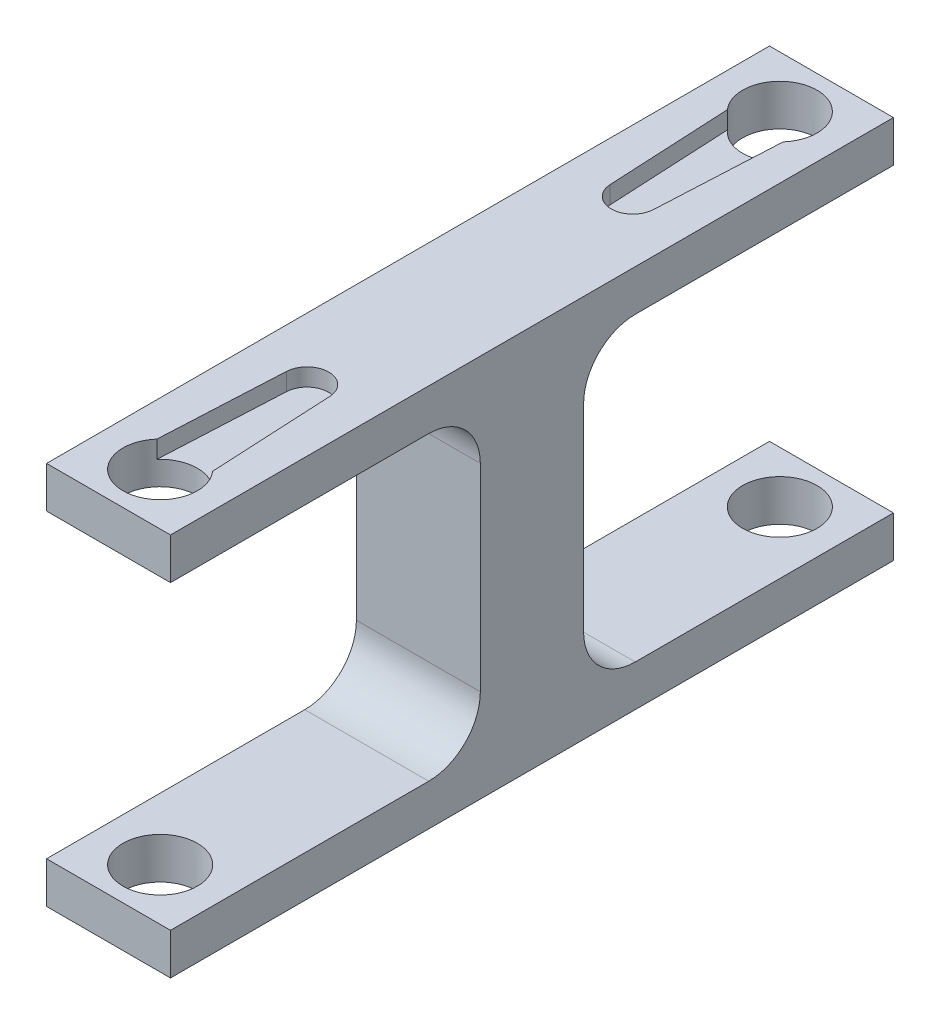
ISO-10303-21;
HEADER;
FILE_DESCRIPTION(('STEP AP214'),'2;1');
FILE_NAME('part.step','',(''),(''),'','','');
FILE_SCHEMA(('AUTOMOTIVE_DESIGN { 1 0 10303 214 1 1 1 1 }'));
ENDSEC;
DATA;
#1=APPLICATION_CONTEXT('core data for automotive mechanical design processes');
#2=APPLICATION_PROTOCOL_DEFINITION('international standard','automotive_design',2000,#1);
#3=PRODUCT_CONTEXT('',#1,'mechanical');
#4=PRODUCT('Part','Part','',(#3));
#5=PRODUCT_RELATED_PRODUCT_CATEGORY('part','',(#4));
#6=PRODUCT_DEFINITION_FORMATION('','',#4);
#7=PRODUCT_DEFINITION_CONTEXT('part definition',#1,'design');
#8=PRODUCT_DEFINITION('design','',#6,#7);
#9=PRODUCT_DEFINITION_SHAPE('','',#8);
#10=(LENGTH_UNIT() NAMED_UNIT(*) SI_UNIT(.MILLI.,.METRE.));
#11=(NAMED_UNIT(*) PLANE_ANGLE_UNIT() SI_UNIT($,.RADIAN.));
#12=(NAMED_UNIT(*) SI_UNIT($,.STERADIAN.) SOLID_ANGLE_UNIT());
#13=UNCERTAINTY_MEASURE_WITH_UNIT(LENGTH_MEASURE(1.E-05),#10,'distance_accuracy_value','');
#14=(GEOMETRIC_REPRESENTATION_CONTEXT(3) GLOBAL_UNCERTAINTY_ASSIGNED_CONTEXT((#13)) GLOBAL_UNIT_ASSIGNED_CONTEXT((#10,
#11,#12)) REPRESENTATION_CONTEXT('',''));
#15=CARTESIAN_POINT('',(0.,0.,0.));
#16=DIRECTION('',(0.,0.,1.));
#17=DIRECTION('',(1.,0.,0.));
#18=AXIS2_PLACEMENT_3D('',#15,#16,#17);
#19=CARTESIAN_POINT('',(0.,0.,-7.5));
#20=DIRECTION('',(0.,0.,-1.));
#21=DIRECTION('',(-1.,0.,0.));
#22=AXIS2_PLACEMENT_3D('',#19,#20,#21);
#23=PLANE('',#22);
#24=DIRECTION('',(0.,-1.,0.));
#25=VECTOR('',#24,1.);
#26=CARTESIAN_POINT('',(3.38839891031811,0.966548743541004,-7.5));
#27=LINE('',#26,#25);
#28=CARTESIAN_POINT('',(3.38839891031811,-8.033451256459,-7.5));
#29=VERTEX_POINT('',#28);
#30=CARTESIAN_POINT('',(3.38839891031811,-27.183451256459,-7.5));
#31=VERTEX_POINT('',#30);
#32=EDGE_CURVE('E277',#29,#31,#27,.T.);
#33=ORIENTED_EDGE('',*,*,#32,.T.);
#34=DIRECTION('',(1.,0.,0.));
#35=VECTOR('',#34,1.);
#36=CARTESIAN_POINT('',(0.,-27.183451256459,-7.5));
#37=LINE('',#36,#35);
#38=CARTESIAN_POINT('',(-8.61160108968189,-27.183451256459,-7.5));
#39=VERTEX_POINT('',#38);
#40=EDGE_CURVE('E60',#31,#39,#37,.F.);
#41=ORIENTED_EDGE('',*,*,#40,.T.);
#42=DIRECTION('',(0.,1.,0.));
#43=VECTOR('',#42,1.);
#44=CARTESIAN_POINT('',(-8.61160108968189,0.966548743541004,-7.5));
#45=LINE('',#44,#43);
#46=CARTESIAN_POINT('',(-8.61160108968189,-8.03345125645899,-7.5));
#47=VERTEX_POINT('',#46);
#48=EDGE_CURVE('E279',#39,#47,#45,.T.);
#49=ORIENTED_EDGE('',*,*,#48,.T.);
#50=DIRECTION('',(-1.,0.,0.));
#51=VECTOR('',#50,1.);
#52=CARTESIAN_POINT('',(0.,-8.033451256459,-7.5));
#53=LINE('',#52,#51);
#54=EDGE_CURVE('E378',#47,#29,#53,.F.);
#55=ORIENTED_EDGE('',*,*,#54,.T.);
#56=EDGE_LOOP('',(#33,#41,#49,#55));
#57=FACE_BOUND('',#56,.T.);
#58=ADVANCED_FACE('F39',(#57),#23,.T.);
#59=CARTESIAN_POINT('',(0.,0.,2.5));
#60=DIRECTION('',(0.,0.,1.));
#61=DIRECTION('',(1.,0.,0.));
#62=AXIS2_PLACEMENT_3D('',#59,#60,#61);
#63=PLANE('',#62);
#64=DIRECTION('',(0.,-1.,0.));
#65=VECTOR('',#64,1.);
#66=CARTESIAN_POINT('',(-8.61160108968189,0.,2.5));
#67=LINE('',#66,#65);
#68=CARTESIAN_POINT('',(-8.61160108968189,-8.033451256459,2.5));
#69=VERTEX_POINT('',#68);
#70=CARTESIAN_POINT('',(-8.61160108968189,-27.183451256459,2.5));
#71=VERTEX_POINT('',#70);
#72=EDGE_CURVE('E346',#69,#71,#67,.T.);
#73=ORIENTED_EDGE('',*,*,#72,.T.);
#74=DIRECTION('',(-1.,0.,0.));
#75=VECTOR('',#74,1.);
#76=CARTESIAN_POINT('',(0.,-27.183451256459,2.5));
#77=LINE('',#76,#75);
#78=CARTESIAN_POINT('',(3.38839891031811,-27.183451256459,2.5));
#79=VERTEX_POINT('',#78);
#80=EDGE_CURVE('E369',#71,#79,#77,.F.);
#81=ORIENTED_EDGE('',*,*,#80,.T.);
#82=DIRECTION('',(0.,-1.,0.));
#83=VECTOR('',#82,1.);
#84=CARTESIAN_POINT('',(3.38839891031811,0.,2.5));
#85=LINE('',#84,#83);
#86=CARTESIAN_POINT('',(3.38839891031811,-8.033451256459,2.5));
#87=VERTEX_POINT('',#86);
#88=EDGE_CURVE('E343',#87,#79,#85,.T.);
#89=ORIENTED_EDGE('',*,*,#88,.F.);
#90=DIRECTION('',(1.,0.,0.));
#91=VECTOR('',#90,1.);
#92=CARTESIAN_POINT('',(0.,-8.033451256459,2.5));
#93=LINE('',#92,#91);
#94=EDGE_CURVE('E360',#87,#69,#93,.F.);
#95=ORIENTED_EDGE('',*,*,#94,.T.);
#96=EDGE_LOOP('',(#73,#81,#89,#95));
#97=FACE_BOUND('',#96,.T.);
#98=ADVANCED_FACE('F413',(#97),#63,.T.);
#99=CARTESIAN_POINT('',(3.38839891031811,0.,2.5));
#100=DIRECTION('',(1.,0.,0.));
#101=DIRECTION('',(0.,1.,0.));
#102=AXIS2_PLACEMENT_3D('',#99,#100,#101);
#103=PLANE('',#102);
#104=DIRECTION('',(0.,0.,-1.));
#105=VECTOR('',#104,1.);
#106=CARTESIAN_POINT('',(3.38839891031812,-36.183451256459,2.5));
#107=LINE('',#106,#105);
#108=CARTESIAN_POINT('',(3.38839891031811,-36.183451256459,32.5));
#109=VERTEX_POINT('',#108);
#110=CARTESIAN_POINT('',(3.38839891031811,-36.183451256459,-37.5));
#111=VERTEX_POINT('',#110);
#112=EDGE_CURVE('E349',#109,#111,#107,.T.);
#113=ORIENTED_EDGE('',*,*,#112,.T.);
#114=DIRECTION('',(0.,-1.,0.));
#115=VECTOR('',#114,1.);
#116=CARTESIAN_POINT('',(3.38839891031811,-36.183451256459,-37.5));
#117=LINE('',#116,#115);
#118=CARTESIAN_POINT('',(3.38839891031811,-32.183451256459,-37.5));
#119=VERTEX_POINT('',#118);
#120=EDGE_CURVE('E220',#119,#111,#117,.T.);
#121=ORIENTED_EDGE('',*,*,#120,.F.);
#122=DIRECTION('',(0.,0.,1.));
#123=VECTOR('',#122,1.);
#124=CARTESIAN_POINT('',(3.38839891031811,-32.183451256459,-37.5));
#125=LINE('',#124,#123);
#126=CARTESIAN_POINT('',(3.38839891031811,-32.183451256459,-12.5));
#127=VERTEX_POINT('',#126);
#128=EDGE_CURVE('E255',#119,#127,#125,.T.);
#129=ORIENTED_EDGE('',*,*,#128,.T.);
#130=CARTESIAN_POINT('',(3.38839891031811,-27.183451256459,-12.5));
#131=DIRECTION('',(1.,0.,0.));
#132=DIRECTION('',(0.,1.,0.));
#133=AXIS2_PLACEMENT_3D('',#130,#131,#132);
#134=CIRCLE('',#133,5.);
#135=EDGE_CURVE('E47',#127,#31,#134,.F.);
#136=ORIENTED_EDGE('',*,*,#135,.T.);
#137=ORIENTED_EDGE('',*,*,#32,.F.);
#138=CARTESIAN_POINT('',(3.38839891031811,-8.033451256459,-12.5));
#139=DIRECTION('',(1.,0.,0.));
#140=DIRECTION('',(0.,1.,0.));
#141=AXIS2_PLACEMENT_3D('',#138,#139,#140);
#142=CIRCLE('',#141,5.);
#143=CARTESIAN_POINT('',(3.38839891031811,-3.033451256459,-12.5));
#144=VERTEX_POINT('',#143);
#145=EDGE_CURVE('E383',#29,#144,#142,.F.);
#146=ORIENTED_EDGE('',*,*,#145,.T.);
#147=DIRECTION('',(0.,0.,1.));
#148=VECTOR('',#147,1.);
#149=CARTESIAN_POINT('',(3.38839891031811,-3.033451256459,-37.5));
#150=LINE('',#149,#148);
#151=CARTESIAN_POINT('',(3.38839891031811,-3.033451256459,-37.5));
#152=VERTEX_POINT('',#151);
#153=EDGE_CURVE('E274',#152,#144,#150,.T.);
#154=ORIENTED_EDGE('',*,*,#153,.F.);
#155=DIRECTION('',(0.,-1.,0.));
#156=VECTOR('',#155,1.);
#157=CARTESIAN_POINT('',(3.38839891031811,0.966548743541004,-37.5));
#158=LINE('',#157,#156);
#159=CARTESIAN_POINT('',(3.38839891031811,0.966548743541004,-37.5));
#160=VERTEX_POINT('',#159);
#161=EDGE_CURVE('E260',#160,#152,#158,.T.);
#162=ORIENTED_EDGE('',*,*,#161,.F.);
#163=DIRECTION('',(0.,0.,-1.));
#164=VECTOR('',#163,1.);
#165=CARTESIAN_POINT('',(3.38839891031811,0.966548743541004,2.5));
#166=LINE('',#165,#164);
#167=CARTESIAN_POINT('',(3.38839891031811,0.966548743541004,32.5));
#168=VERTEX_POINT('',#167);
#169=EDGE_CURVE('E355',#168,#160,#166,.T.);
#170=ORIENTED_EDGE('',*,*,#169,.F.);
#171=DIRECTION('',(0.,1.,0.));
#172=VECTOR('',#171,1.);
#173=CARTESIAN_POINT('',(3.38839891031811,0.966548743541004,32.5));
#174=LINE('',#173,#172);
#175=CARTESIAN_POINT('',(3.38839891031811,-3.033451256459,32.5));
#176=VERTEX_POINT('',#175);
#177=EDGE_CURVE('E331',#176,#168,#174,.T.);
#178=ORIENTED_EDGE('',*,*,#177,.F.);
#179=DIRECTION('',(0.,0.,-1.));
#180=VECTOR('',#179,1.);
#181=CARTESIAN_POINT('',(3.38839891031811,-3.033451256459,32.5));
#182=LINE('',#181,#180);
#183=CARTESIAN_POINT('',(3.38839891031811,-3.033451256459,7.5));
#184=VERTEX_POINT('',#183);
#185=EDGE_CURVE('E337',#176,#184,#182,.T.);
#186=ORIENTED_EDGE('',*,*,#185,.T.);
#187=CARTESIAN_POINT('',(3.38839891031811,-8.033451256459,7.5));
#188=DIRECTION('',(1.,0.,0.));
#189=DIRECTION('',(0.,1.,0.));
#190=AXIS2_PLACEMENT_3D('',#187,#188,#189);
#191=CIRCLE('',#190,5.);
#192=EDGE_CURVE('E362',#184,#87,#191,.F.);
#193=ORIENTED_EDGE('',*,*,#192,.T.);
#194=ORIENTED_EDGE('',*,*,#88,.T.);
#195=CARTESIAN_POINT('',(3.38839891031811,-27.183451256459,7.5));
#196=DIRECTION('',(1.,0.,0.));
#197=DIRECTION('',(0.,1.,0.));
#198=AXIS2_PLACEMENT_3D('',#195,#196,#197);
#199=CIRCLE('',#198,5.);
#200=CARTESIAN_POINT('',(3.38839891031811,-32.183451256459,7.5));
#201=VERTEX_POINT('',#200);
#202=EDGE_CURVE('E373',#79,#201,#199,.F.);
#203=ORIENTED_EDGE('',*,*,#202,.T.);
#204=DIRECTION('',(0.,0.,-1.));
#205=VECTOR('',#204,1.);
#206=CARTESIAN_POINT('',(3.38839891031811,-32.183451256459,32.5));
#207=LINE('',#206,#205);
#208=CARTESIAN_POINT('',(3.38839891031811,-32.183451256459,32.5));
#209=VERTEX_POINT('',#208);
#210=EDGE_CURVE('E323',#209,#201,#207,.T.);
#211=ORIENTED_EDGE('',*,*,#210,.F.);
#212=DIRECTION('',(0.,1.,0.));
#213=VECTOR('',#212,1.);
#214=CARTESIAN_POINT('',(3.38839891031811,-36.183451256459,32.5));
#215=LINE('',#214,#213);
#216=EDGE_CURVE('E316',#109,#209,#215,.T.);
#217=ORIENTED_EDGE('',*,*,#216,.F.);
#218=EDGE_LOOP('',(#113,#121,#129,#136,#137,#146,#154,#162,#170,#178,#186,#193,#194,#203,#211,#217));
#219=FACE_BOUND('',#218,.T.);
#220=ADVANCED_FACE('F397',(#219),#103,.T.);
#221=CARTESIAN_POINT('',(0.,0.966548743541004,2.5));
#222=DIRECTION('',(0.,1.,0.));
#223=DIRECTION('',(0.,0.,1.));
#224=AXIS2_PLACEMENT_3D('',#221,#222,#223);
#225=PLANE('',#224);
#226=CARTESIAN_POINT('',(-2.61160108968189,0.966548743541004,-32.5));
#227=DIRECTION('',(0.,1.,0.));
#228=DIRECTION('',(0.,0.,1.));
#229=AXIS2_PLACEMENT_3D('',#226,#227,#228);
#230=CIRCLE('',#229,3.6);
#231=CARTESIAN_POINT('',(0.088398910318118,0.966548743541004,-30.1188238200419));
#232=VERTEX_POINT('',#231);
#233=CARTESIAN_POINT('',(-5.31160108968188,0.966548743541004,-30.1188238200419));
#234=VERTEX_POINT('',#233);
#235=EDGE_CURVE('E234',#232,#234,#230,.T.);
#236=ORIENTED_EDGE('',*,*,#235,.F.);
#237=DIRECTION('',(0.050368035382124,0.,-0.99873072497633));
#238=VECTOR('',#237,1.);
#239=CARTESIAN_POINT('',(0.088398910318118,0.966548743541004,-30.1188238200419));
#240=LINE('',#239,#238);
#241=CARTESIAN_POINT('',(-0.514266567231549,0.966548743541004,-18.1687740564372));
#242=VERTEX_POINT('',#241);
#243=EDGE_CURVE('E218',#242,#232,#240,.T.);
#244=ORIENTED_EDGE('',*,*,#243,.F.);
#245=CARTESIAN_POINT('',(-2.61160108968184,0.966548743541004,-18.2745469307396));
#246=DIRECTION('',(0.,1.,0.));
#247=DIRECTION('',(0.,0.,1.));
#248=AXIS2_PLACEMENT_3D('',#245,#246,#247);
#249=CIRCLE('',#248,2.1);
#250=CARTESIAN_POINT('',(-4.70893561213213,0.966548743541004,-18.1687740564372));
#251=VERTEX_POINT('',#250);
#252=EDGE_CURVE('E240',#251,#242,#249,.T.);
#253=ORIENTED_EDGE('',*,*,#252,.F.);
#254=DIRECTION('',(0.050368035382131,0.,0.998730724976329));
#255=VECTOR('',#254,1.);
#256=CARTESIAN_POINT('',(-4.70893561213213,0.966548743541004,-18.1687740564372));
#257=LINE('',#256,#255);
#258=EDGE_CURVE('E236',#234,#251,#257,.T.);
#259=ORIENTED_EDGE('',*,*,#258,.F.);
#260=EDGE_LOOP('',(#236,#244,#253,#259));
#261=FACE_BOUND('',#260,.T.);
#262=CARTESIAN_POINT('',(-2.61160108968189,0.966548743541004,27.5));
#263=DIRECTION('',(0.,1.,0.));
#264=DIRECTION('',(0.,0.,1.));
#265=AXIS2_PLACEMENT_3D('',#262,#263,#264);
#266=CIRCLE('',#265,3.6);
#267=CARTESIAN_POINT('',(-5.31160108968192,0.966548743541004,25.1188238200419));
#268=VERTEX_POINT('',#267);
#269=CARTESIAN_POINT('',(0.0883989103180828,0.966548743541004,25.1188238200418));
#270=VERTEX_POINT('',#269);
#271=EDGE_CURVE('E281',#268,#270,#266,.T.);
#272=ORIENTED_EDGE('',*,*,#271,.F.);
#273=DIRECTION('',(-0.0503680353821171,0.,0.99873072497633));
#274=VECTOR('',#273,1.);
#275=CARTESIAN_POINT('',(-5.31160108968192,0.966548743541004,25.1188238200419));
#276=LINE('',#275,#274);
#277=CARTESIAN_POINT('',(-4.70893561213234,0.966548743541004,13.1687740564373));
#278=VERTEX_POINT('',#277);
#279=EDGE_CURVE('E286',#278,#268,#276,.T.);
#280=ORIENTED_EDGE('',*,*,#279,.F.);
#281=CARTESIAN_POINT('',(-2.61160108968204,0.966548743541004,13.2745469307397));
#282=DIRECTION('',(0.,1.,0.));
#283=DIRECTION('',(0.,0.,1.));
#284=AXIS2_PLACEMENT_3D('',#281,#282,#283);
#285=CIRCLE('',#284,2.1);
#286=CARTESIAN_POINT('',(-0.514266567231752,0.966548743541004,13.1687740564372));
#287=VERTEX_POINT('',#286);
#288=EDGE_CURVE('E297',#287,#278,#285,.T.);
#289=ORIENTED_EDGE('',*,*,#288,.F.);
#290=DIRECTION('',(-0.0503680353821383,0.,-0.998730724976329));
#291=VECTOR('',#290,1.);
#292=CARTESIAN_POINT('',(-0.514266567231752,0.966548743541004,13.1687740564372));
#293=LINE('',#292,#291);
#294=EDGE_CURVE('E294',#270,#287,#293,.T.);
#295=ORIENTED_EDGE('',*,*,#294,.F.);
#296=EDGE_LOOP('',(#272,#280,#289,#295));
#297=FACE_BOUND('',#296,.T.);
#298=ORIENTED_EDGE('',*,*,#169,.T.);
#299=DIRECTION('',(1.,0.,0.));
#300=VECTOR('',#299,1.);
#301=CARTESIAN_POINT('',(3.38839891031811,0.966548743541004,-37.5));
#302=LINE('',#301,#300);
#303=CARTESIAN_POINT('',(-8.61160108968189,0.966548743541004,-37.5));
#304=VERTEX_POINT('',#303);
#305=EDGE_CURVE('E268',#304,#160,#302,.T.);
#306=ORIENTED_EDGE('',*,*,#305,.F.);
#307=DIRECTION('',(0.,0.,-1.));
#308=VECTOR('',#307,1.);
#309=CARTESIAN_POINT('',(-8.61160108968189,0.966548743541004,2.5));
#310=LINE('',#309,#308);
#311=CARTESIAN_POINT('',(-8.61160108968189,0.966548743541004,32.5));
#312=VERTEX_POINT('',#311);
#313=EDGE_CURVE('E353',#312,#304,#310,.T.);
#314=ORIENTED_EDGE('',*,*,#313,.F.);
#315=DIRECTION('',(-1.,0.,0.));
#316=VECTOR('',#315,1.);
#317=CARTESIAN_POINT('',(-8.61160108968189,0.966548743541004,32.5));
#318=LINE('',#317,#316);
#319=EDGE_CURVE('E334',#168,#312,#318,.T.);
#320=ORIENTED_EDGE('',*,*,#319,.F.);
#321=EDGE_LOOP('',(#298,#306,#314,#320));
#322=FACE_BOUND('',#321,.T.);
#323=ADVANCED_FACE('F466',(#261,#297,#322),#225,.T.);
#324=CARTESIAN_POINT('',(-8.61160108968189,0.,2.5));
#325=DIRECTION('',(1.,0.,0.));
#326=DIRECTION('',(0.,1.,0.));
#327=AXIS2_PLACEMENT_3D('',#324,#325,#326);
#328=PLANE('',#327);
#329=ORIENTED_EDGE('',*,*,#313,.T.);
#330=DIRECTION('',(0.,1.,0.));
#331=VECTOR('',#330,1.);
#332=CARTESIAN_POINT('',(-8.61160108968189,0.966548743541004,-37.5));
#333=LINE('',#332,#331);
#334=CARTESIAN_POINT('',(-8.61160108968189,-3.03345125645899,-37.5));
#335=VERTEX_POINT('',#334);
#336=EDGE_CURVE('E265',#335,#304,#333,.T.);
#337=ORIENTED_EDGE('',*,*,#336,.F.);
#338=DIRECTION('',(0.,0.,1.));
#339=VECTOR('',#338,1.);
#340=CARTESIAN_POINT('',(-8.61160108968189,-3.03345125645899,-37.5));
#341=LINE('',#340,#339);
#342=CARTESIAN_POINT('',(-8.61160108968189,-3.03345125645899,-12.5));
#343=VERTEX_POINT('',#342);
#344=EDGE_CURVE('E271',#335,#343,#341,.T.);
#345=ORIENTED_EDGE('',*,*,#344,.T.);
#346=CARTESIAN_POINT('',(-8.61160108968189,-8.03345125645899,-12.5));
#347=DIRECTION('',(1.,0.,0.));
#348=DIRECTION('',(0.,1.,0.));
#349=AXIS2_PLACEMENT_3D('',#346,#347,#348);
#350=CIRCLE('',#349,5.);
#351=EDGE_CURVE('E380',#343,#47,#350,.T.);
#352=ORIENTED_EDGE('',*,*,#351,.T.);
#353=ORIENTED_EDGE('',*,*,#48,.F.);
#354=CARTESIAN_POINT('',(-8.61160108968189,-27.183451256459,-12.5));
#355=DIRECTION('',(1.,0.,0.));
#356=DIRECTION('',(0.,1.,0.));
#357=AXIS2_PLACEMENT_3D('',#354,#355,#356);
#358=CIRCLE('',#357,5.);
#359=CARTESIAN_POINT('',(-8.61160108968189,-32.183451256459,-12.5));
#360=VERTEX_POINT('',#359);
#361=EDGE_CURVE('E11',#39,#360,#358,.T.);
#362=ORIENTED_EDGE('',*,*,#361,.T.);
#363=DIRECTION('',(0.,0.,1.));
#364=VECTOR('',#363,1.);
#365=CARTESIAN_POINT('',(-8.61160108968189,-32.183451256459,-37.5));
#366=LINE('',#365,#364);
#367=CARTESIAN_POINT('',(-8.61160108968189,-32.183451256459,-37.5));
#368=VERTEX_POINT('',#367);
#369=EDGE_CURVE('E257',#368,#360,#366,.T.);
#370=ORIENTED_EDGE('',*,*,#369,.F.);
#371=DIRECTION('',(0.,1.,0.));
#372=VECTOR('',#371,1.);
#373=CARTESIAN_POINT('',(-8.61160108968188,-36.183451256459,-37.5));
#374=LINE('',#373,#372);
#375=CARTESIAN_POINT('',(-8.61160108968188,-36.183451256459,-37.5));
#376=VERTEX_POINT('',#375);
#377=EDGE_CURVE('E251',#376,#368,#374,.T.);
#378=ORIENTED_EDGE('',*,*,#377,.F.);
#379=DIRECTION('',(0.,0.,-1.));
#380=VECTOR('',#379,1.);
#381=CARTESIAN_POINT('',(-8.61160108968189,-36.183451256459,2.5));
#382=LINE('',#381,#380);
#383=CARTESIAN_POINT('',(-8.61160108968189,-36.183451256459,32.5));
#384=VERTEX_POINT('',#383);
#385=EDGE_CURVE('E351',#384,#376,#382,.T.);
#386=ORIENTED_EDGE('',*,*,#385,.F.);
#387=DIRECTION('',(0.,-1.,0.));
#388=VECTOR('',#387,1.);
#389=CARTESIAN_POINT('',(-8.61160108968189,-36.183451256459,32.5));
#390=LINE('',#389,#388);
#391=CARTESIAN_POINT('',(-8.61160108968189,-32.183451256459,32.5));
#392=VERTEX_POINT('',#391);
#393=EDGE_CURVE('E304',#392,#384,#390,.T.);
#394=ORIENTED_EDGE('',*,*,#393,.F.);
#395=DIRECTION('',(0.,0.,-1.));
#396=VECTOR('',#395,1.);
#397=CARTESIAN_POINT('',(-8.61160108968189,-32.183451256459,32.5));
#398=LINE('',#397,#396);
#399=CARTESIAN_POINT('',(-8.61160108968189,-32.183451256459,7.5));
#400=VERTEX_POINT('',#399);
#401=EDGE_CURVE('E320',#392,#400,#398,.T.);
#402=ORIENTED_EDGE('',*,*,#401,.T.);
#403=CARTESIAN_POINT('',(-8.61160108968189,-27.183451256459,7.5));
#404=DIRECTION('',(1.,0.,0.));
#405=DIRECTION('',(0.,1.,0.));
#406=AXIS2_PLACEMENT_3D('',#403,#404,#405);
#407=CIRCLE('',#406,5.);
#408=EDGE_CURVE('E371',#400,#71,#407,.T.);
#409=ORIENTED_EDGE('',*,*,#408,.T.);
#410=ORIENTED_EDGE('',*,*,#72,.F.);
#411=CARTESIAN_POINT('',(-8.61160108968189,-8.033451256459,7.5));
#412=DIRECTION('',(1.,0.,0.));
#413=DIRECTION('',(0.,1.,0.));
#414=AXIS2_PLACEMENT_3D('',#411,#412,#413);
#415=CIRCLE('',#414,5.);
#416=CARTESIAN_POINT('',(-8.61160108968189,-3.033451256459,7.5));
#417=VERTEX_POINT('',#416);
#418=EDGE_CURVE('E364',#69,#417,#415,.T.);
#419=ORIENTED_EDGE('',*,*,#418,.T.);
#420=DIRECTION('',(0.,0.,-1.));
#421=VECTOR('',#420,1.);
#422=CARTESIAN_POINT('',(-8.61160108968189,-3.033451256459,32.5));
#423=LINE('',#422,#421);
#424=CARTESIAN_POINT('',(-8.61160108968189,-3.033451256459,32.5));
#425=VERTEX_POINT('',#424);
#426=EDGE_CURVE('E340',#425,#417,#423,.T.);
#427=ORIENTED_EDGE('',*,*,#426,.F.);
#428=DIRECTION('',(0.,-1.,0.));
#429=VECTOR('',#428,1.);
#430=CARTESIAN_POINT('',(-8.61160108968189,0.966548743541004,32.5));
#431=LINE('',#430,#429);
#432=EDGE_CURVE('E326',#312,#425,#431,.T.);
#433=ORIENTED_EDGE('',*,*,#432,.F.);
#434=EDGE_LOOP('',(#329,#337,#345,#352,#353,#362,#370,#378,#386,#394,#402,#409,#410,#419,#427,#433));
#435=FACE_BOUND('',#434,.T.);
#436=ADVANCED_FACE('F404',(#435),#328,.F.);
#437=CARTESIAN_POINT('',(0.,-36.183451256459,2.5));
#438=DIRECTION('',(0.,1.,0.));
#439=DIRECTION('',(0.,0.,1.));
#440=AXIS2_PLACEMENT_3D('',#437,#438,#439);
#441=PLANE('',#440);
#442=CARTESIAN_POINT('',(-2.61160108968189,-36.183451256459,-32.5));
#443=DIRECTION('',(0.,1.,0.));
#444=DIRECTION('',(0.,0.,1.));
#445=AXIS2_PLACEMENT_3D('',#442,#443,#444);
#446=CIRCLE('',#445,3.6);
#447=CARTESIAN_POINT('',(-2.61160108968189,-36.183451256459,-28.9));
#448=VERTEX_POINT('',#447);
#449=EDGE_CURVE('E529',#448,#448,#446,.T.);
#450=ORIENTED_EDGE('',*,*,#449,.T.);
#451=EDGE_LOOP('',(#450));
#452=FACE_BOUND('',#451,.T.);
#453=CARTESIAN_POINT('',(-2.61160108968189,-36.183451256459,27.5));
#454=DIRECTION('',(0.,1.,0.));
#455=DIRECTION('',(0.,0.,1.));
#456=AXIS2_PLACEMENT_3D('',#453,#454,#455);
#457=CIRCLE('',#456,3.6);
#458=CARTESIAN_POINT('',(-2.61160108968189,-36.183451256459,31.1));
#459=VERTEX_POINT('',#458);
#460=EDGE_CURVE('E522',#459,#459,#457,.T.);
#461=ORIENTED_EDGE('',*,*,#460,.T.);
#462=EDGE_LOOP('',(#461));
#463=FACE_BOUND('',#462,.T.);
#464=ORIENTED_EDGE('',*,*,#385,.T.);
#465=DIRECTION('',(-1.,0.,0.));
#466=VECTOR('',#465,1.);
#467=CARTESIAN_POINT('',(3.38839891031811,-36.183451256459,-37.5));
#468=LINE('',#467,#466);
#469=EDGE_CURVE('E248',#111,#376,#468,.T.);
#470=ORIENTED_EDGE('',*,*,#469,.F.);
#471=ORIENTED_EDGE('',*,*,#112,.F.);
#472=DIRECTION('',(1.,0.,0.));
#473=VECTOR('',#472,1.);
#474=CARTESIAN_POINT('',(-8.61160108968189,-36.183451256459,32.5));
#475=LINE('',#474,#473);
#476=EDGE_CURVE('E313',#384,#109,#475,.T.);
#477=ORIENTED_EDGE('',*,*,#476,.F.);
#478=EDGE_LOOP('',(#464,#470,#471,#477));
#479=FACE_BOUND('',#478,.T.);
#480=ADVANCED_FACE('F458',(#452,#463,#479),#441,.F.);
#481=CARTESIAN_POINT('',(-8.61160108968189,-3.033451256459,32.5));
#482=DIRECTION('',(0.,1.,0.));
#483=DIRECTION('',(0.,0.,1.));
#484=AXIS2_PLACEMENT_3D('',#481,#482,#483);
#485=PLANE('',#484);
#486=CARTESIAN_POINT('',(-2.61160108968189,-3.03345125645899,27.5));
#487=DIRECTION('',(0.,1.,0.));
#488=DIRECTION('',(0.,0.,1.));
#489=AXIS2_PLACEMENT_3D('',#486,#487,#488);
#490=CIRCLE('',#489,3.6);
#491=CARTESIAN_POINT('',(-2.61160108968189,-3.03345125645899,31.1));
#492=VERTEX_POINT('',#491);
#493=EDGE_CURVE('E237',#492,#492,#490,.T.);
#494=ORIENTED_EDGE('',*,*,#493,.T.);
#495=EDGE_LOOP('',(#494));
#496=FACE_BOUND('',#495,.T.);
#497=ORIENTED_EDGE('',*,*,#426,.T.);
#498=DIRECTION('',(1.,0.,0.));
#499=VECTOR('',#498,1.);
#500=CARTESIAN_POINT('',(-8.61160108968189,-3.033451256459,7.5));
#501=LINE('',#500,#499);
#502=EDGE_CURVE('E210',#417,#184,#501,.T.);
#503=ORIENTED_EDGE('',*,*,#502,.T.);
#504=ORIENTED_EDGE('',*,*,#185,.F.);
#505=DIRECTION('',(1.,0.,0.));
#506=VECTOR('',#505,1.);
#507=CARTESIAN_POINT('',(-8.61160108968189,-3.033451256459,32.5));
#508=LINE('',#507,#506);
#509=EDGE_CURVE('E329',#425,#176,#508,.T.);
#510=ORIENTED_EDGE('',*,*,#509,.F.);
#511=EDGE_LOOP('',(#497,#503,#504,#510));
#512=FACE_BOUND('',#511,.T.);
#513=ADVANCED_FACE('F455',(#496,#512),#485,.F.);
#514=CARTESIAN_POINT('',(0.,0.,32.5));
#515=DIRECTION('',(0.,0.,1.));
#516=DIRECTION('',(1.,0.,0.));
#517=AXIS2_PLACEMENT_3D('',#514,#515,#516);
#518=PLANE('',#517);
#519=ORIENTED_EDGE('',*,*,#432,.T.);
#520=ORIENTED_EDGE('',*,*,#509,.T.);
#521=ORIENTED_EDGE('',*,*,#177,.T.);
#522=ORIENTED_EDGE('',*,*,#319,.T.);
#523=EDGE_LOOP('',(#519,#520,#521,#522));
#524=FACE_BOUND('',#523,.T.);
#525=ADVANCED_FACE('F451',(#524),#518,.T.);
#526=CARTESIAN_POINT('',(-8.61160108968189,-32.183451256459,32.5));
#527=DIRECTION('',(0.,-1.,0.));
#528=DIRECTION('',(0.,0.,-1.));
#529=AXIS2_PLACEMENT_3D('',#526,#527,#528);
#530=PLANE('',#529);
#531=CARTESIAN_POINT('',(-2.61160108968189,-32.183451256459,27.5));
#532=DIRECTION('',(0.,-1.,0.));
#533=DIRECTION('',(0.,0.,-1.));
#534=AXIS2_PLACEMENT_3D('',#531,#532,#533);
#535=CIRCLE('',#534,3.6);
#536=CARTESIAN_POINT('',(-2.61160108968189,-32.183451256459,23.9));
#537=VERTEX_POINT('',#536);
#538=EDGE_CURVE('E526',#537,#537,#535,.T.);
#539=ORIENTED_EDGE('',*,*,#538,.T.);
#540=EDGE_LOOP('',(#539));
#541=FACE_BOUND('',#540,.T.);
#542=ORIENTED_EDGE('',*,*,#210,.T.);
#543=DIRECTION('',(-1.,0.,0.));
#544=VECTOR('',#543,1.);
#545=CARTESIAN_POINT('',(-8.61160108968189,-32.183451256459,7.5));
#546=LINE('',#545,#544);
#547=EDGE_CURVE('E366',#201,#400,#546,.T.);
#548=ORIENTED_EDGE('',*,*,#547,.T.);
#549=ORIENTED_EDGE('',*,*,#401,.F.);
#550=DIRECTION('',(-1.,0.,0.));
#551=VECTOR('',#550,1.);
#552=CARTESIAN_POINT('',(-8.61160108968189,-32.183451256459,32.5));
#553=LINE('',#552,#551);
#554=EDGE_CURVE('E318',#209,#392,#553,.T.);
#555=ORIENTED_EDGE('',*,*,#554,.F.);
#556=EDGE_LOOP('',(#542,#548,#549,#555));
#557=FACE_BOUND('',#556,.T.);
#558=ADVANCED_FACE('F447',(#541,#557),#530,.F.);
#559=CARTESIAN_POINT('',(0.,0.,32.5));
#560=DIRECTION('',(0.,0.,-1.));
#561=DIRECTION('',(-1.,0.,0.));
#562=AXIS2_PLACEMENT_3D('',#559,#560,#561);
#563=PLANE('',#562);
#564=ORIENTED_EDGE('',*,*,#393,.T.);
#565=ORIENTED_EDGE('',*,*,#476,.T.);
#566=ORIENTED_EDGE('',*,*,#216,.T.);
#567=ORIENTED_EDGE('',*,*,#554,.T.);
#568=EDGE_LOOP('',(#564,#565,#566,#567));
#569=FACE_BOUND('',#568,.T.);
#570=ADVANCED_FACE('F443',(#569),#563,.F.);
#571=CARTESIAN_POINT('',(-2.61160108968189,-0.733451256458996,27.5));
#572=DIRECTION('',(0.,1.,0.));
#573=DIRECTION('',(0.,0.,1.));
#574=AXIS2_PLACEMENT_3D('',#571,#572,#573);
#575=CYLINDRICAL_SURFACE('',#574,3.6);
#576=ORIENTED_EDGE('',*,*,#271,.T.);
#577=DIRECTION('',(0.,1.,0.));
#578=VECTOR('',#577,1.);
#579=CARTESIAN_POINT('',(0.0883989103180827,-0.733451256458996,25.1188238200418));
#580=LINE('',#579,#578);
#581=CARTESIAN_POINT('',(0.0883989103180813,-0.733451256458996,25.1188238200418));
#582=VERTEX_POINT('',#581);
#583=EDGE_CURVE('E292',#582,#270,#580,.T.);
#584=ORIENTED_EDGE('',*,*,#583,.F.);
#585=CARTESIAN_POINT('',(-2.61160108968189,-0.733451256458996,27.5));
#586=DIRECTION('',(0.,1.,0.));
#587=DIRECTION('',(0.,0.,1.));
#588=AXIS2_PLACEMENT_3D('',#585,#586,#587);
#589=CIRCLE('',#588,3.6);
#590=CARTESIAN_POINT('',(-5.31160108968192,-0.733451256458996,25.1188238200419));
#591=VERTEX_POINT('',#590);
#592=EDGE_CURVE('E211',#582,#591,#589,.T.);
#593=ORIENTED_EDGE('',*,*,#592,.T.);
#594=DIRECTION('',(0.,1.,0.));
#595=VECTOR('',#594,1.);
#596=CARTESIAN_POINT('',(-5.31160108968192,-0.733451256458996,25.1188238200419));
#597=LINE('',#596,#595);
#598=EDGE_CURVE('E302',#591,#268,#597,.T.);
#599=ORIENTED_EDGE('',*,*,#598,.T.);
#600=EDGE_LOOP('',(#576,#584,#593,#599));
#601=FACE_BOUND('',#600,.T.);
#602=ORIENTED_EDGE('',*,*,#493,.F.);
#603=EDGE_LOOP('',(#602));
#604=FACE_BOUND('',#603,.T.);
#605=ADVANCED_FACE('F433',(#601,#604),#575,.F.);
#606=CARTESIAN_POINT('',(-5.31160108968192,-0.733451256458996,25.1188238200419));
#607=DIRECTION('',(-0.99873072497633,0.,-0.0503680353821171));
#608=DIRECTION('',(-0.0503680353821171,0.,0.99873072497633));
#609=AXIS2_PLACEMENT_3D('',#606,#607,#608);
#610=PLANE('',#609);
#611=ORIENTED_EDGE('',*,*,#279,.T.);
#612=ORIENTED_EDGE('',*,*,#598,.F.);
#613=DIRECTION('',(-0.0503680353821171,0.,0.99873072497633));
#614=VECTOR('',#613,1.);
#615=CARTESIAN_POINT('',(-5.31160108968192,-0.733451256458996,25.1188238200419));
#616=LINE('',#615,#614);
#617=CARTESIAN_POINT('',(-4.70893561213234,-0.733451256458996,13.1687740564373));
#618=VERTEX_POINT('',#617);
#619=EDGE_CURVE('E289',#618,#591,#616,.T.);
#620=ORIENTED_EDGE('',*,*,#619,.F.);
#621=DIRECTION('',(0.,1.,0.));
#622=VECTOR('',#621,1.);
#623=CARTESIAN_POINT('',(-4.70893561213234,-0.733451256458996,13.1687740564373));
#624=LINE('',#623,#622);
#625=EDGE_CURVE('E305',#618,#278,#624,.T.);
#626=ORIENTED_EDGE('',*,*,#625,.T.);
#627=EDGE_LOOP('',(#611,#612,#620,#626));
#628=FACE_BOUND('',#627,.T.);
#629=ADVANCED_FACE('F429',(#628),#610,.F.);
#630=CARTESIAN_POINT('',(-2.61160108968204,-0.733451256458996,13.2745469307397));
#631=DIRECTION('',(0.,1.,0.));
#632=DIRECTION('',(0.,0.,1.));
#633=AXIS2_PLACEMENT_3D('',#630,#631,#632);
#634=CYLINDRICAL_SURFACE('',#633,2.1);
#635=ORIENTED_EDGE('',*,*,#288,.T.);
#636=ORIENTED_EDGE('',*,*,#625,.F.);
#637=CARTESIAN_POINT('',(-2.61160108968204,-0.733451256458996,13.2745469307397));
#638=DIRECTION('',(0.,1.,0.));
#639=DIRECTION('',(0.,0.,1.));
#640=AXIS2_PLACEMENT_3D('',#637,#638,#639);
#641=CIRCLE('',#640,2.1);
#642=CARTESIAN_POINT('',(-0.514266567231752,-0.733451256458996,13.1687740564372));
#643=VERTEX_POINT('',#642);
#644=EDGE_CURVE('E285',#643,#618,#641,.T.);
#645=ORIENTED_EDGE('',*,*,#644,.F.);
#646=DIRECTION('',(0.,1.,0.));
#647=VECTOR('',#646,1.);
#648=CARTESIAN_POINT('',(-0.514266567231752,-0.733451256458996,13.1687740564372));
#649=LINE('',#648,#647);
#650=EDGE_CURVE('E307',#643,#287,#649,.T.);
#651=ORIENTED_EDGE('',*,*,#650,.T.);
#652=EDGE_LOOP('',(#635,#636,#645,#651));
#653=FACE_BOUND('',#652,.T.);
#654=ADVANCED_FACE('F432',(#653),#634,.F.);
#655=CARTESIAN_POINT('',(-0.514266567231752,-0.733451256458996,13.1687740564372));
#656=DIRECTION('',(0.998730724976329,0.,-0.0503680353821383));
#657=DIRECTION('',(-0.0503680353821383,0.,-0.998730724976329));
#658=AXIS2_PLACEMENT_3D('',#655,#656,#657);
#659=PLANE('',#658);
#660=ORIENTED_EDGE('',*,*,#294,.T.);
#661=ORIENTED_EDGE('',*,*,#650,.F.);
#662=DIRECTION('',(-0.0503680353821383,0.,-0.998730724976329));
#663=VECTOR('',#662,1.);
#664=CARTESIAN_POINT('',(-0.514266567231752,-0.733451256458996,13.1687740564372));
#665=LINE('',#664,#663);
#666=EDGE_CURVE('E282',#582,#643,#665,.T.);
#667=ORIENTED_EDGE('',*,*,#666,.F.);
#668=ORIENTED_EDGE('',*,*,#583,.T.);
#669=EDGE_LOOP('',(#660,#661,#667,#668));
#670=FACE_BOUND('',#669,.T.);
#671=ADVANCED_FACE('F427',(#670),#659,.F.);
#672=CARTESIAN_POINT('',(-2.61160108968189,-0.733451256458996,27.5));
#673=DIRECTION('',(0.,1.,0.));
#674=DIRECTION('',(0.,0.,1.));
#675=AXIS2_PLACEMENT_3D('',#672,#673,#674);
#676=PLANE('',#675);
#677=ORIENTED_EDGE('',*,*,#592,.F.);
#678=ORIENTED_EDGE('',*,*,#666,.T.);
#679=ORIENTED_EDGE('',*,*,#644,.T.);
#680=ORIENTED_EDGE('',*,*,#619,.T.);
#681=EDGE_LOOP('',(#677,#678,#679,#680));
#682=FACE_BOUND('',#681,.T.);
#683=ADVANCED_FACE('F424',(#682),#676,.T.);
#684=CARTESIAN_POINT('',(3.38839891031811,-3.033451256459,-37.5));
#685=DIRECTION('',(0.,1.,0.));
#686=DIRECTION('',(-1.,0.,0.));
#687=AXIS2_PLACEMENT_3D('',#684,#685,#686);
#688=PLANE('',#687);
#689=CARTESIAN_POINT('',(-2.61160108968189,-3.03345125645899,-32.5));
#690=DIRECTION('',(0.,1.,0.));
#691=DIRECTION('',(-1.,0.,0.));
#692=AXIS2_PLACEMENT_3D('',#689,#690,#691);
#693=CIRCLE('',#692,3.6);
#694=CARTESIAN_POINT('',(-6.21160108968189,-3.03345125645899,-32.5));
#695=VERTEX_POINT('',#694);
#696=EDGE_CURVE('E521',#695,#695,#693,.T.);
#697=ORIENTED_EDGE('',*,*,#696,.T.);
#698=EDGE_LOOP('',(#697));
#699=FACE_BOUND('',#698,.T.);
#700=ORIENTED_EDGE('',*,*,#153,.T.);
#701=DIRECTION('',(-1.,0.,0.));
#702=VECTOR('',#701,1.);
#703=CARTESIAN_POINT('',(3.38839891031811,-3.033451256459,-12.5));
#704=LINE('',#703,#702);
#705=EDGE_CURVE('E375',#144,#343,#704,.T.);
#706=ORIENTED_EDGE('',*,*,#705,.T.);
#707=ORIENTED_EDGE('',*,*,#344,.F.);
#708=DIRECTION('',(-1.,0.,0.));
#709=VECTOR('',#708,1.);
#710=CARTESIAN_POINT('',(3.38839891031811,-3.033451256459,-37.5));
#711=LINE('',#710,#709);
#712=EDGE_CURVE('E263',#152,#335,#711,.T.);
#713=ORIENTED_EDGE('',*,*,#712,.F.);
#714=EDGE_LOOP('',(#700,#706,#707,#713));
#715=FACE_BOUND('',#714,.T.);
#716=ADVANCED_FACE('F422',(#699,#715),#688,.F.);
#717=CARTESIAN_POINT('',(0.,0.,-37.5));
#718=DIRECTION('',(0.,0.,-1.));
#719=DIRECTION('',(-1.,0.,0.));
#720=AXIS2_PLACEMENT_3D('',#717,#718,#719);
#721=PLANE('',#720);
#722=ORIENTED_EDGE('',*,*,#161,.T.);
#723=ORIENTED_EDGE('',*,*,#712,.T.);
#724=ORIENTED_EDGE('',*,*,#336,.T.);
#725=ORIENTED_EDGE('',*,*,#305,.T.);
#726=EDGE_LOOP('',(#722,#723,#724,#725));
#727=FACE_BOUND('',#726,.T.);
#728=ADVANCED_FACE('F506',(#727),#721,.T.);
#729=CARTESIAN_POINT('',(3.38839891031811,-32.183451256459,-37.5));
#730=DIRECTION('',(0.,-1.,0.));
#731=DIRECTION('',(0.,0.,-1.));
#732=AXIS2_PLACEMENT_3D('',#729,#730,#731);
#733=PLANE('',#732);
#734=CARTESIAN_POINT('',(-2.61160108968189,-32.183451256459,-32.5));
#735=DIRECTION('',(0.,-1.,0.));
#736=DIRECTION('',(0.,0.,-1.));
#737=AXIS2_PLACEMENT_3D('',#734,#735,#736);
#738=CIRCLE('',#737,3.6);
#739=CARTESIAN_POINT('',(-2.61160108968189,-32.183451256459,-36.1));
#740=VERTEX_POINT('',#739);
#741=EDGE_CURVE('E523',#740,#740,#738,.T.);
#742=ORIENTED_EDGE('',*,*,#741,.T.);
#743=EDGE_LOOP('',(#742));
#744=FACE_BOUND('',#743,.T.);
#745=ORIENTED_EDGE('',*,*,#369,.T.);
#746=DIRECTION('',(1.,0.,0.));
#747=VECTOR('',#746,1.);
#748=CARTESIAN_POINT('',(3.38839891031811,-32.183451256459,-12.5));
#749=LINE('',#748,#747);
#750=EDGE_CURVE('E385',#360,#127,#749,.T.);
#751=ORIENTED_EDGE('',*,*,#750,.T.);
#752=ORIENTED_EDGE('',*,*,#128,.F.);
#753=DIRECTION('',(1.,0.,0.));
#754=VECTOR('',#753,1.);
#755=CARTESIAN_POINT('',(3.38839891031811,-32.183451256459,-37.5));
#756=LINE('',#755,#754);
#757=EDGE_CURVE('E253',#368,#119,#756,.T.);
#758=ORIENTED_EDGE('',*,*,#757,.F.);
#759=EDGE_LOOP('',(#745,#751,#752,#758));
#760=FACE_BOUND('',#759,.T.);
#761=ADVANCED_FACE('F391',(#744,#760),#733,.F.);
#762=CARTESIAN_POINT('',(0.,0.,-37.5));
#763=DIRECTION('',(0.,0.,1.));
#764=DIRECTION('',(1.,0.,0.));
#765=AXIS2_PLACEMENT_3D('',#762,#763,#764);
#766=PLANE('',#765);
#767=ORIENTED_EDGE('',*,*,#120,.T.);
#768=ORIENTED_EDGE('',*,*,#469,.T.);
#769=ORIENTED_EDGE('',*,*,#377,.T.);
#770=ORIENTED_EDGE('',*,*,#757,.T.);
#771=EDGE_LOOP('',(#767,#768,#769,#770));
#772=FACE_BOUND('',#771,.T.);
#773=ADVANCED_FACE('F401',(#772),#766,.F.);
#774=CARTESIAN_POINT('',(-2.61160108968189,-0.733451256458996,-32.5));
#775=DIRECTION('',(0.,1.,0.));
#776=DIRECTION('',(0.,0.,1.));
#777=AXIS2_PLACEMENT_3D('',#774,#775,#776);
#778=CYLINDRICAL_SURFACE('',#777,3.6);
#779=ORIENTED_EDGE('',*,*,#235,.T.);
#780=DIRECTION('',(0.,1.,0.));
#781=VECTOR('',#780,1.);
#782=CARTESIAN_POINT('',(-5.31160108968188,-0.733451256458996,-30.1188238200419));
#783=LINE('',#782,#781);
#784=CARTESIAN_POINT('',(-5.31160108968188,-0.733451256458996,-30.1188238200419));
#785=VERTEX_POINT('',#784);
#786=EDGE_CURVE('E205',#785,#234,#783,.T.);
#787=ORIENTED_EDGE('',*,*,#786,.F.);
#788=CARTESIAN_POINT('',(-2.61160108968189,-0.733451256458996,-32.5));
#789=DIRECTION('',(0.,1.,0.));
#790=DIRECTION('',(0.,0.,1.));
#791=AXIS2_PLACEMENT_3D('',#788,#789,#790);
#792=CIRCLE('',#791,3.6);
#793=CARTESIAN_POINT('',(0.0883989103181177,-0.733451256458996,-30.1188238200419));
#794=VERTEX_POINT('',#793);
#795=EDGE_CURVE('E198',#785,#794,#792,.T.);
#796=ORIENTED_EDGE('',*,*,#795,.T.);
#797=DIRECTION('',(0.,1.,0.));
#798=VECTOR('',#797,1.);
#799=CARTESIAN_POINT('',(0.088398910318118,-0.733451256458996,-30.1188238200419));
#800=LINE('',#799,#798);
#801=EDGE_CURVE('E202',#794,#232,#800,.T.);
#802=ORIENTED_EDGE('',*,*,#801,.T.);
#803=EDGE_LOOP('',(#779,#787,#796,#802));
#804=FACE_BOUND('',#803,.T.);
#805=ORIENTED_EDGE('',*,*,#696,.F.);
#806=EDGE_LOOP('',(#805));
#807=FACE_BOUND('',#806,.T.);
#808=ADVANCED_FACE('F200',(#804,#807),#778,.F.);
#809=CARTESIAN_POINT('',(0.088398910318118,-0.733451256458996,-30.1188238200419));
#810=DIRECTION('',(0.99873072497633,0.,0.050368035382124));
#811=DIRECTION('',(0.050368035382124,0.,-0.99873072497633));
#812=AXIS2_PLACEMENT_3D('',#809,#810,#811);
#813=PLANE('',#812);
#814=ORIENTED_EDGE('',*,*,#243,.T.);
#815=ORIENTED_EDGE('',*,*,#801,.F.);
#816=DIRECTION('',(0.050368035382124,0.,-0.99873072497633));
#817=VECTOR('',#816,1.);
#818=CARTESIAN_POINT('',(0.088398910318118,-0.733451256458996,-30.1188238200419));
#819=LINE('',#818,#817);
#820=CARTESIAN_POINT('',(-0.514266567231549,-0.733451256458996,-18.1687740564372));
#821=VERTEX_POINT('',#820);
#822=EDGE_CURVE('E216',#821,#794,#819,.T.);
#823=ORIENTED_EDGE('',*,*,#822,.F.);
#824=DIRECTION('',(0.,1.,0.));
#825=VECTOR('',#824,1.);
#826=CARTESIAN_POINT('',(-0.514266567231549,-0.733451256458996,-18.1687740564372));
#827=LINE('',#826,#825);
#828=EDGE_CURVE('E221',#821,#242,#827,.T.);
#829=ORIENTED_EDGE('',*,*,#828,.T.);
#830=EDGE_LOOP('',(#814,#815,#823,#829));
#831=FACE_BOUND('',#830,.T.);
#832=ADVANCED_FACE('F215',(#831),#813,.F.);
#833=CARTESIAN_POINT('',(-2.61160108968184,-0.733451256458996,-18.2745469307396));
#834=DIRECTION('',(0.,1.,0.));
#835=DIRECTION('',(0.,0.,1.));
#836=AXIS2_PLACEMENT_3D('',#833,#834,#835);
#837=CYLINDRICAL_SURFACE('',#836,2.1);
#838=ORIENTED_EDGE('',*,*,#252,.T.);
#839=ORIENTED_EDGE('',*,*,#828,.F.);
#840=CARTESIAN_POINT('',(-2.61160108968184,-0.733451256458996,-18.2745469307396));
#841=DIRECTION('',(0.,1.,0.));
#842=DIRECTION('',(0.,0.,1.));
#843=AXIS2_PLACEMENT_3D('',#840,#841,#842);
#844=CIRCLE('',#843,2.1);
#845=CARTESIAN_POINT('',(-4.70893561213213,-0.733451256458996,-18.1687740564372));
#846=VERTEX_POINT('',#845);
#847=EDGE_CURVE('E226',#846,#821,#844,.T.);
#848=ORIENTED_EDGE('',*,*,#847,.F.);
#849=DIRECTION('',(0.,1.,0.));
#850=VECTOR('',#849,1.);
#851=CARTESIAN_POINT('',(-4.70893561213213,-0.733451256458996,-18.1687740564372));
#852=LINE('',#851,#850);
#853=EDGE_CURVE('E228',#846,#251,#852,.T.);
#854=ORIENTED_EDGE('',*,*,#853,.T.);
#855=EDGE_LOOP('',(#838,#839,#848,#854));
#856=FACE_BOUND('',#855,.T.);
#857=ADVANCED_FACE('F541',(#856),#837,.F.);
#858=CARTESIAN_POINT('',(-4.70893561213213,-0.733451256458996,-18.1687740564372));
#859=DIRECTION('',(-0.998730724976329,0.,0.050368035382131));
#860=DIRECTION('',(0.050368035382131,0.,0.99873072497633));
#861=AXIS2_PLACEMENT_3D('',#858,#859,#860);
#862=PLANE('',#861);
#863=ORIENTED_EDGE('',*,*,#258,.T.);
#864=ORIENTED_EDGE('',*,*,#853,.F.);
#865=DIRECTION('',(0.050368035382131,0.,0.998730724976329));
#866=VECTOR('',#865,1.);
#867=CARTESIAN_POINT('',(-4.70893561213213,-0.733451256458996,-18.1687740564372));
#868=LINE('',#867,#866);
#869=EDGE_CURVE('E230',#785,#846,#868,.T.);
#870=ORIENTED_EDGE('',*,*,#869,.F.);
#871=ORIENTED_EDGE('',*,*,#786,.T.);
#872=EDGE_LOOP('',(#863,#864,#870,#871));
#873=FACE_BOUND('',#872,.T.);
#874=ADVANCED_FACE('F537',(#873),#862,.F.);
#875=CARTESIAN_POINT('',(-2.61160108968189,-0.733451256458996,-32.5));
#876=DIRECTION('',(0.,1.,0.));
#877=DIRECTION('',(0.,0.,1.));
#878=AXIS2_PLACEMENT_3D('',#875,#876,#877);
#879=PLANE('',#878);
#880=ORIENTED_EDGE('',*,*,#795,.F.);
#881=ORIENTED_EDGE('',*,*,#869,.T.);
#882=ORIENTED_EDGE('',*,*,#847,.T.);
#883=ORIENTED_EDGE('',*,*,#822,.T.);
#884=EDGE_LOOP('',(#880,#881,#882,#883));
#885=FACE_BOUND('',#884,.T.);
#886=ADVANCED_FACE('F224',(#885),#879,.T.);
#887=CARTESIAN_POINT('',(-2.61160108968189,-36.183451256459,27.5));
#888=DIRECTION('',(0.,1.,0.));
#889=DIRECTION('',(0.,0.,1.));
#890=AXIS2_PLACEMENT_3D('',#887,#888,#889);
#891=CYLINDRICAL_SURFACE('',#890,3.6);
#892=ORIENTED_EDGE('',*,*,#460,.F.);
#893=EDGE_LOOP('',(#892));
#894=FACE_BOUND('',#893,.T.);
#895=ORIENTED_EDGE('',*,*,#538,.F.);
#896=EDGE_LOOP('',(#895));
#897=FACE_BOUND('',#896,.T.);
#898=ADVANCED_FACE('F575',(#894,#897),#891,.F.);
#899=CARTESIAN_POINT('',(-2.61160108968189,-36.183451256459,-32.5));
#900=DIRECTION('',(0.,1.,0.));
#901=DIRECTION('',(0.,0.,1.));
#902=AXIS2_PLACEMENT_3D('',#899,#900,#901);
#903=CYLINDRICAL_SURFACE('',#902,3.6);
#904=ORIENTED_EDGE('',*,*,#449,.F.);
#905=EDGE_LOOP('',(#904));
#906=FACE_BOUND('',#905,.T.);
#907=ORIENTED_EDGE('',*,*,#741,.F.);
#908=EDGE_LOOP('',(#907));
#909=FACE_BOUND('',#908,.T.);
#910=ADVANCED_FACE('F475',(#906,#909),#903,.F.);
#911=CARTESIAN_POINT('',(-8.61160108968189,-8.033451256459,7.5));
#912=DIRECTION('',(1.,0.,0.));
#913=DIRECTION('',(0.,0.,-1.));
#914=AXIS2_PLACEMENT_3D('',#911,#912,#913);
#915=CYLINDRICAL_SURFACE('',#914,5.);
#916=ORIENTED_EDGE('',*,*,#418,.F.);
#917=ORIENTED_EDGE('',*,*,#94,.F.);
#918=ORIENTED_EDGE('',*,*,#192,.F.);
#919=ORIENTED_EDGE('',*,*,#502,.F.);
#920=EDGE_LOOP('',(#916,#917,#918,#919));
#921=FACE_BOUND('',#920,.T.);
#922=ADVANCED_FACE('F472',(#921),#915,.F.);
#923=CARTESIAN_POINT('',(-8.61160108968189,-27.183451256459,7.5));
#924=DIRECTION('',(-1.,0.,0.));
#925=DIRECTION('',(0.,0.,1.));
#926=AXIS2_PLACEMENT_3D('',#923,#924,#925);
#927=CYLINDRICAL_SURFACE('',#926,5.);
#928=ORIENTED_EDGE('',*,*,#202,.F.);
#929=ORIENTED_EDGE('',*,*,#80,.F.);
#930=ORIENTED_EDGE('',*,*,#408,.F.);
#931=ORIENTED_EDGE('',*,*,#547,.F.);
#932=EDGE_LOOP('',(#928,#929,#930,#931));
#933=FACE_BOUND('',#932,.T.);
#934=ADVANCED_FACE('F410',(#933),#927,.F.);
#935=CARTESIAN_POINT('',(3.38839891031811,-8.033451256459,-12.5));
#936=DIRECTION('',(-1.,0.,0.));
#937=DIRECTION('',(0.,-1.,0.));
#938=AXIS2_PLACEMENT_3D('',#935,#936,#937);
#939=CYLINDRICAL_SURFACE('',#938,5.);
#940=ORIENTED_EDGE('',*,*,#145,.F.);
#941=ORIENTED_EDGE('',*,*,#54,.F.);
#942=ORIENTED_EDGE('',*,*,#351,.F.);
#943=ORIENTED_EDGE('',*,*,#705,.F.);
#944=EDGE_LOOP('',(#940,#941,#942,#943));
#945=FACE_BOUND('',#944,.T.);
#946=ADVANCED_FACE('F406',(#945),#939,.F.);
#947=CARTESIAN_POINT('',(3.38839891031811,-27.183451256459,-12.5));
#948=DIRECTION('',(1.,0.,0.));
#949=DIRECTION('',(0.,0.,-1.));
#950=AXIS2_PLACEMENT_3D('',#947,#948,#949);
#951=CYLINDRICAL_SURFACE('',#950,5.);
#952=ORIENTED_EDGE('',*,*,#361,.F.);
#953=ORIENTED_EDGE('',*,*,#40,.F.);
#954=ORIENTED_EDGE('',*,*,#135,.F.);
#955=ORIENTED_EDGE('',*,*,#750,.F.);
#956=EDGE_LOOP('',(#952,#953,#954,#955));
#957=FACE_BOUND('',#956,.T.);
#958=ADVANCED_FACE('F41',(#957),#951,.F.);
#959=CLOSED_SHELL('',(#58,#98,#220,#323,#436,#480,#513,#525,#558,#570,#605,#629,#654,#671,#683,
#716,#728,#761,#773,#808,#832,#857,#874,#886,#898,#910,#922,#934,#946,#958));
#960=MANIFOLD_SOLID_BREP('B2',#959);
#961=ADVANCED_BREP_SHAPE_REPRESENTATION('',(#18,#960),#14);
#962=SHAPE_DEFINITION_REPRESENTATION(#9,#961);
ENDSEC;
END-ISO-10303-21;
